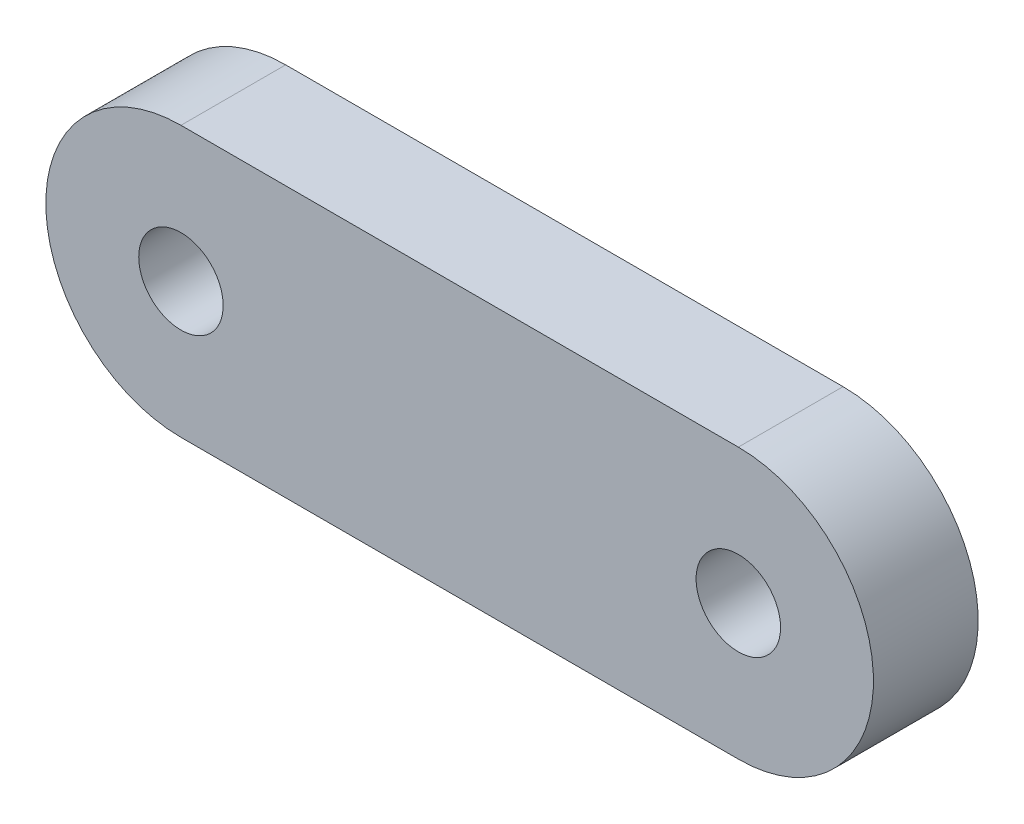
ISO-10303-21;
HEADER;
FILE_DESCRIPTION(('STEP AP214'),'2;1');
FILE_NAME('part.step','',(''),(''),'','','');
FILE_SCHEMA(('AUTOMOTIVE_DESIGN { 1 0 10303 214 1 1 1 1 }'));
ENDSEC;
DATA;
#1=APPLICATION_CONTEXT('core data for automotive mechanical design processes');
#2=APPLICATION_PROTOCOL_DEFINITION('international standard','automotive_design',2000,#1);
#3=PRODUCT_CONTEXT('',#1,'mechanical');
#4=PRODUCT('Part','Part','',(#3));
#5=PRODUCT_RELATED_PRODUCT_CATEGORY('part','',(#4));
#6=PRODUCT_DEFINITION_FORMATION('','',#4);
#7=PRODUCT_DEFINITION_CONTEXT('part definition',#1,'design');
#8=PRODUCT_DEFINITION('design','',#6,#7);
#9=PRODUCT_DEFINITION_SHAPE('','',#8);
#10=(LENGTH_UNIT() NAMED_UNIT(*) SI_UNIT(.MILLI.,.METRE.));
#11=(NAMED_UNIT(*) PLANE_ANGLE_UNIT() SI_UNIT($,.RADIAN.));
#12=(NAMED_UNIT(*) SI_UNIT($,.STERADIAN.) SOLID_ANGLE_UNIT());
#13=UNCERTAINTY_MEASURE_WITH_UNIT(LENGTH_MEASURE(1.E-05),#10,'distance_accuracy_value','');
#14=(GEOMETRIC_REPRESENTATION_CONTEXT(3) GLOBAL_UNCERTAINTY_ASSIGNED_CONTEXT((#13)) GLOBAL_UNIT_ASSIGNED_CONTEXT((#10,
#11,#12)) REPRESENTATION_CONTEXT('',''));
#15=CARTESIAN_POINT('',(0.,0.,0.));
#16=DIRECTION('',(0.,0.,1.));
#17=DIRECTION('',(1.,0.,0.));
#18=AXIS2_PLACEMENT_3D('',#15,#16,#17);
#19=CARTESIAN_POINT('',(0.,0.,6.2));
#20=DIRECTION('',(0.,0.,1.));
#21=DIRECTION('',(1.,0.,0.));
#22=AXIS2_PLACEMENT_3D('',#19,#20,#21);
#23=PLANE('',#22);
#24=CARTESIAN_POINT('',(33.,0.,6.2));
#25=DIRECTION('',(0.,0.,1.));
#26=DIRECTION('',(1.,0.,0.));
#27=AXIS2_PLACEMENT_3D('',#24,#25,#26);
#28=CIRCLE('',#27,2.5);
#29=CARTESIAN_POINT('',(35.5,0.,6.2));
#30=VERTEX_POINT('',#29);
#31=EDGE_CURVE('E140',#30,#30,#28,.T.);
#32=ORIENTED_EDGE('',*,*,#31,.F.);
#33=EDGE_LOOP('',(#32));
#34=FACE_BOUND('',#33,.T.);
#35=CARTESIAN_POINT('',(0.,0.,6.2));
#36=DIRECTION('',(0.,0.,1.));
#37=DIRECTION('',(1.,0.,0.));
#38=AXIS2_PLACEMENT_3D('',#35,#36,#37);
#39=CIRCLE('',#38,8.);
#40=CARTESIAN_POINT('',(0.,8.,6.2));
#41=VERTEX_POINT('',#40);
#42=CARTESIAN_POINT('',(0.,-8.,6.2));
#43=VERTEX_POINT('',#42);
#44=EDGE_CURVE('E94',#41,#43,#39,.T.);
#45=ORIENTED_EDGE('',*,*,#44,.T.);
#46=DIRECTION('',(1.,0.,0.));
#47=VECTOR('',#46,1.);
#48=CARTESIAN_POINT('',(0.,-8.,6.2));
#49=LINE('',#48,#47);
#50=CARTESIAN_POINT('',(33.,-8.,6.2));
#51=VERTEX_POINT('',#50);
#52=EDGE_CURVE('E89',#43,#51,#49,.T.);
#53=ORIENTED_EDGE('',*,*,#52,.T.);
#54=CARTESIAN_POINT('',(33.,0.,6.2));
#55=DIRECTION('',(0.,0.,1.));
#56=DIRECTION('',(1.,0.,0.));
#57=AXIS2_PLACEMENT_3D('',#54,#55,#56);
#58=CIRCLE('',#57,8.);
#59=CARTESIAN_POINT('',(33.,8.,6.2));
#60=VERTEX_POINT('',#59);
#61=EDGE_CURVE('E92',#51,#60,#58,.T.);
#62=ORIENTED_EDGE('',*,*,#61,.T.);
#63=DIRECTION('',(-1.,0.,0.));
#64=VECTOR('',#63,1.);
#65=CARTESIAN_POINT('',(0.,8.,6.2));
#66=LINE('',#65,#64);
#67=EDGE_CURVE('E59',#60,#41,#66,.T.);
#68=ORIENTED_EDGE('',*,*,#67,.T.);
#69=EDGE_LOOP('',(#45,#53,#62,#68));
#70=FACE_BOUND('',#69,.T.);
#71=CARTESIAN_POINT('',(0.,0.,6.2));
#72=DIRECTION('',(0.,0.,1.));
#73=DIRECTION('',(1.,0.,0.));
#74=AXIS2_PLACEMENT_3D('',#71,#72,#73);
#75=CIRCLE('',#74,2.5);
#76=CARTESIAN_POINT('',(-2.5,0.,6.2));
#77=VERTEX_POINT('',#76);
#78=EDGE_CURVE('E115',#77,#77,#75,.T.);
#79=ORIENTED_EDGE('',*,*,#78,.F.);
#80=EDGE_LOOP('',(#79));
#81=FACE_BOUND('',#80,.T.);
#82=ADVANCED_FACE('F40',(#34,#70,#81),#23,.T.);
#83=CARTESIAN_POINT('',(0.,0.,0.));
#84=DIRECTION('',(0.,0.,1.));
#85=DIRECTION('',(1.,0.,0.));
#86=AXIS2_PLACEMENT_3D('',#83,#84,#85);
#87=PLANE('',#86);
#88=CARTESIAN_POINT('',(33.,0.,0.));
#89=DIRECTION('',(0.,0.,1.));
#90=DIRECTION('',(1.,0.,0.));
#91=AXIS2_PLACEMENT_3D('',#88,#89,#90);
#92=CIRCLE('',#91,2.5);
#93=CARTESIAN_POINT('',(35.5,0.,0.));
#94=VERTEX_POINT('',#93);
#95=EDGE_CURVE('E44',#94,#94,#92,.T.);
#96=ORIENTED_EDGE('',*,*,#95,.T.);
#97=EDGE_LOOP('',(#96));
#98=FACE_BOUND('',#97,.T.);
#99=CARTESIAN_POINT('',(0.,0.,0.));
#100=DIRECTION('',(0.,0.,1.));
#101=DIRECTION('',(1.,0.,0.));
#102=AXIS2_PLACEMENT_3D('',#99,#100,#101);
#103=CIRCLE('',#102,8.);
#104=CARTESIAN_POINT('',(0.,8.,0.));
#105=VERTEX_POINT('',#104);
#106=CARTESIAN_POINT('',(0.,-8.,0.));
#107=VERTEX_POINT('',#106);
#108=EDGE_CURVE('E111',#105,#107,#103,.T.);
#109=ORIENTED_EDGE('',*,*,#108,.F.);
#110=DIRECTION('',(-1.,0.,0.));
#111=VECTOR('',#110,1.);
#112=CARTESIAN_POINT('',(0.,8.,0.));
#113=LINE('',#112,#111);
#114=CARTESIAN_POINT('',(33.,8.,0.));
#115=VERTEX_POINT('',#114);
#116=EDGE_CURVE('E82',#115,#105,#113,.T.);
#117=ORIENTED_EDGE('',*,*,#116,.F.);
#118=CARTESIAN_POINT('',(33.,0.,0.));
#119=DIRECTION('',(0.,0.,1.));
#120=DIRECTION('',(1.,0.,0.));
#121=AXIS2_PLACEMENT_3D('',#118,#119,#120);
#122=CIRCLE('',#121,8.);
#123=CARTESIAN_POINT('',(33.,-8.,0.));
#124=VERTEX_POINT('',#123);
#125=EDGE_CURVE('E76',#124,#115,#122,.T.);
#126=ORIENTED_EDGE('',*,*,#125,.F.);
#127=DIRECTION('',(1.,0.,0.));
#128=VECTOR('',#127,1.);
#129=CARTESIAN_POINT('',(0.,-8.,0.));
#130=LINE('',#129,#128);
#131=EDGE_CURVE('E99',#107,#124,#130,.T.);
#132=ORIENTED_EDGE('',*,*,#131,.F.);
#133=EDGE_LOOP('',(#109,#117,#126,#132));
#134=FACE_BOUND('',#133,.T.);
#135=CARTESIAN_POINT('',(0.,0.,0.));
#136=DIRECTION('',(0.,0.,1.));
#137=DIRECTION('',(1.,0.,0.));
#138=AXIS2_PLACEMENT_3D('',#135,#136,#137);
#139=CIRCLE('',#138,2.5);
#140=CARTESIAN_POINT('',(-2.5,0.,0.));
#141=VERTEX_POINT('',#140);
#142=EDGE_CURVE('E133',#141,#141,#139,.T.);
#143=ORIENTED_EDGE('',*,*,#142,.T.);
#144=EDGE_LOOP('',(#143));
#145=FACE_BOUND('',#144,.T.);
#146=ADVANCED_FACE('F128',(#98,#134,#145),#87,.F.);
#147=CARTESIAN_POINT('',(0.,0.,6.2));
#148=DIRECTION('',(0.,0.,-1.));
#149=DIRECTION('',(-1.,0.,0.));
#150=AXIS2_PLACEMENT_3D('',#147,#148,#149);
#151=CYLINDRICAL_SURFACE('',#150,8.);
#152=ORIENTED_EDGE('',*,*,#108,.T.);
#153=DIRECTION('',(0.,0.,-1.));
#154=VECTOR('',#153,1.);
#155=CARTESIAN_POINT('',(0.,-8.,6.2));
#156=LINE('',#155,#154);
#157=EDGE_CURVE('E11',#43,#107,#156,.T.);
#158=ORIENTED_EDGE('',*,*,#157,.F.);
#159=ORIENTED_EDGE('',*,*,#44,.F.);
#160=DIRECTION('',(0.,0.,-1.));
#161=VECTOR('',#160,1.);
#162=CARTESIAN_POINT('',(0.,8.,6.2));
#163=LINE('',#162,#161);
#164=EDGE_CURVE('E107',#41,#105,#163,.T.);
#165=ORIENTED_EDGE('',*,*,#164,.T.);
#166=EDGE_LOOP('',(#152,#158,#159,#165));
#167=FACE_BOUND('',#166,.T.);
#168=ADVANCED_FACE('F42',(#167),#151,.T.);
#169=CARTESIAN_POINT('',(0.,-8.,6.2));
#170=DIRECTION('',(0.,1.,0.));
#171=DIRECTION('',(0.,0.,1.));
#172=AXIS2_PLACEMENT_3D('',#169,#170,#171);
#173=PLANE('',#172);
#174=ORIENTED_EDGE('',*,*,#131,.T.);
#175=DIRECTION('',(0.,0.,-1.));
#176=VECTOR('',#175,1.);
#177=CARTESIAN_POINT('',(33.,-8.,6.2));
#178=LINE('',#177,#176);
#179=EDGE_CURVE('E51',#51,#124,#178,.T.);
#180=ORIENTED_EDGE('',*,*,#179,.F.);
#181=ORIENTED_EDGE('',*,*,#52,.F.);
#182=ORIENTED_EDGE('',*,*,#157,.T.);
#183=EDGE_LOOP('',(#174,#180,#181,#182));
#184=FACE_BOUND('',#183,.T.);
#185=ADVANCED_FACE('F98',(#184),#173,.F.);
#186=CARTESIAN_POINT('',(33.,0.,6.2));
#187=DIRECTION('',(0.,0.,-1.));
#188=DIRECTION('',(-1.,0.,0.));
#189=AXIS2_PLACEMENT_3D('',#186,#187,#188);
#190=CYLINDRICAL_SURFACE('',#189,8.);
#191=ORIENTED_EDGE('',*,*,#125,.T.);
#192=DIRECTION('',(0.,0.,-1.));
#193=VECTOR('',#192,1.);
#194=CARTESIAN_POINT('',(33.,8.,6.2));
#195=LINE('',#194,#193);
#196=EDGE_CURVE('E101',#60,#115,#195,.T.);
#197=ORIENTED_EDGE('',*,*,#196,.F.);
#198=ORIENTED_EDGE('',*,*,#61,.F.);
#199=ORIENTED_EDGE('',*,*,#179,.T.);
#200=EDGE_LOOP('',(#191,#197,#198,#199));
#201=FACE_BOUND('',#200,.T.);
#202=ADVANCED_FACE('F103',(#201),#190,.T.);
#203=CARTESIAN_POINT('',(0.,8.,6.2));
#204=DIRECTION('',(0.,-1.,0.));
#205=DIRECTION('',(0.,0.,-1.));
#206=AXIS2_PLACEMENT_3D('',#203,#204,#205);
#207=PLANE('',#206);
#208=ORIENTED_EDGE('',*,*,#116,.T.);
#209=ORIENTED_EDGE('',*,*,#164,.F.);
#210=ORIENTED_EDGE('',*,*,#67,.F.);
#211=ORIENTED_EDGE('',*,*,#196,.T.);
#212=EDGE_LOOP('',(#208,#209,#210,#211));
#213=FACE_BOUND('',#212,.T.);
#214=ADVANCED_FACE('F125',(#213),#207,.F.);
#215=CARTESIAN_POINT('',(0.,0.,6.2));
#216=DIRECTION('',(0.,0.,-1.));
#217=DIRECTION('',(-1.,0.,0.));
#218=AXIS2_PLACEMENT_3D('',#215,#216,#217);
#219=CYLINDRICAL_SURFACE('',#218,2.5);
#220=CARTESIAN_POINT('',(-2.5,0.,6.2));
#221=CARTESIAN_POINT('',(-2.5,0.,6.13541666666667));
#222=CARTESIAN_POINT('',(-2.5,0.,6.07083333333333));
#223=CARTESIAN_POINT('',(-2.5,0.,5.94166666666667));
#224=CARTESIAN_POINT('',(-2.5,0.,5.87708333333333));
#225=CARTESIAN_POINT('',(-2.5,0.,5.74791666666667));
#226=CARTESIAN_POINT('',(-2.5,0.,5.68333333333333));
#227=CARTESIAN_POINT('',(-2.5,0.,5.55416666666667));
#228=CARTESIAN_POINT('',(-2.5,0.,5.48958333333333));
#229=CARTESIAN_POINT('',(-2.5,0.,5.36041666666667));
#230=CARTESIAN_POINT('',(-2.5,0.,5.29583333333333));
#231=CARTESIAN_POINT('',(-2.5,0.,5.16666666666667));
#232=CARTESIAN_POINT('',(-2.5,0.,5.10208333333333));
#233=CARTESIAN_POINT('',(-2.5,0.,4.97291666666667));
#234=CARTESIAN_POINT('',(-2.5,0.,4.90833333333333));
#235=CARTESIAN_POINT('',(-2.5,0.,4.77916666666667));
#236=CARTESIAN_POINT('',(-2.5,0.,4.71458333333333));
#237=CARTESIAN_POINT('',(-2.5,0.,4.58541666666667));
#238=CARTESIAN_POINT('',(-2.5,0.,4.52083333333333));
#239=CARTESIAN_POINT('',(-2.5,0.,4.39166666666667));
#240=CARTESIAN_POINT('',(-2.5,0.,4.32708333333333));
#241=CARTESIAN_POINT('',(-2.5,0.,4.19791666666667));
#242=CARTESIAN_POINT('',(-2.5,0.,4.13333333333333));
#243=CARTESIAN_POINT('',(-2.5,0.,4.00416666666667));
#244=CARTESIAN_POINT('',(-2.5,0.,3.93958333333333));
#245=CARTESIAN_POINT('',(-2.5,0.,3.81041666666667));
#246=CARTESIAN_POINT('',(-2.5,0.,3.74583333333333));
#247=CARTESIAN_POINT('',(-2.5,0.,3.61666666666667));
#248=CARTESIAN_POINT('',(-2.5,0.,3.55208333333333));
#249=CARTESIAN_POINT('',(-2.5,0.,3.42291666666667));
#250=CARTESIAN_POINT('',(-2.5,0.,3.35833333333333));
#251=CARTESIAN_POINT('',(-2.5,0.,3.22916666666667));
#252=CARTESIAN_POINT('',(-2.5,0.,3.16458333333333));
#253=CARTESIAN_POINT('',(-2.5,0.,3.03541666666667));
#254=CARTESIAN_POINT('',(-2.5,0.,2.97083333333333));
#255=CARTESIAN_POINT('',(-2.5,0.,2.84166666666667));
#256=CARTESIAN_POINT('',(-2.5,0.,2.77708333333333));
#257=CARTESIAN_POINT('',(-2.5,0.,2.64791666666667));
#258=CARTESIAN_POINT('',(-2.5,0.,2.58333333333333));
#259=CARTESIAN_POINT('',(-2.5,0.,2.45416666666667));
#260=CARTESIAN_POINT('',(-2.5,0.,2.38958333333333));
#261=CARTESIAN_POINT('',(-2.5,0.,2.26041666666667));
#262=CARTESIAN_POINT('',(-2.5,0.,2.19583333333333));
#263=CARTESIAN_POINT('',(-2.5,0.,2.06666666666667));
#264=CARTESIAN_POINT('',(-2.5,0.,2.00208333333333));
#265=CARTESIAN_POINT('',(-2.5,0.,1.87291666666667));
#266=CARTESIAN_POINT('',(-2.5,0.,1.80833333333333));
#267=CARTESIAN_POINT('',(-2.5,0.,1.67916666666667));
#268=CARTESIAN_POINT('',(-2.5,0.,1.61458333333333));
#269=CARTESIAN_POINT('',(-2.5,0.,1.48541666666667));
#270=CARTESIAN_POINT('',(-2.5,0.,1.42083333333333));
#271=CARTESIAN_POINT('',(-2.5,0.,1.29166666666667));
#272=CARTESIAN_POINT('',(-2.5,0.,1.22708333333333));
#273=CARTESIAN_POINT('',(-2.5,0.,1.09791666666667));
#274=CARTESIAN_POINT('',(-2.5,0.,1.03333333333333));
#275=CARTESIAN_POINT('',(-2.5,0.,0.904166666666667));
#276=CARTESIAN_POINT('',(-2.5,0.,0.839583333333333));
#277=CARTESIAN_POINT('',(-2.5,0.,0.710416666666666));
#278=CARTESIAN_POINT('',(-2.5,0.,0.645833333333333));
#279=CARTESIAN_POINT('',(-2.5,0.,0.516666666666667));
#280=CARTESIAN_POINT('',(-2.5,0.,0.452083333333333));
#281=CARTESIAN_POINT('',(-2.5,0.,0.322916666666667));
#282=CARTESIAN_POINT('',(-2.5,0.,0.258333333333334));
#283=CARTESIAN_POINT('',(-2.5,0.,0.129166666666667));
#284=CARTESIAN_POINT('',(-2.5,0.,0.0645833333333335));
#285=CARTESIAN_POINT('',(-2.5,0.,0.));
#286=B_SPLINE_CURVE_WITH_KNOTS('',3,(#220,#221,#222,#223,#224,#225,#226,#227,#228,#229,#230,
#231,#232,#233,#234,#235,#236,#237,#238,#239,#240,#241,#242,#243,#244,#245,#246,#247,#248,#249,
#250,#251,#252,#253,#254,#255,#256,#257,#258,#259,#260,#261,#262,#263,#264,#265,#266,#267,#268,
#269,#270,#271,#272,#273,#274,#275,#276,#277,#278,#279,#280,#281,#282,#283,#284,#285),
.UNSPECIFIED.,.F.,.F.,(4,2,2,2,2,2,2,2,2,2,2,2,2,2,2,2,2,2,2,2,2,2,2,2,2,2,2,2,2,2,2,2,4),(0.,
0.193749999999999,0.3875,0.581249999999999,0.775,0.968749999999999,1.1625,1.35625,1.55,1.74375,
1.9375,2.13125,2.325,2.51875,2.7125,2.90625,3.1,3.29375,3.4875,3.68125,3.875,4.06875,4.2625,
4.45625,4.65,4.84375,5.0375,5.23125,5.425,5.61875,5.8125,6.00625,6.2),.UNSPECIFIED.);
#287=EDGE_CURVE('BSEAM152',#77,#141,#286,.T.);
#288=ORIENTED_EDGE('',*,*,#78,.T.);
#289=ORIENTED_EDGE('',*,*,#142,.F.);
#290=ORIENTED_EDGE('',*,*,#287,.T.);
#291=ORIENTED_EDGE('',*,*,#287,.F.);
#292=EDGE_LOOP('',(#288,#290,#289,#291));
#293=FACE_BOUND('',#292,.T.);
#294=ADVANCED_FACE('F152',(#293),#219,.F.);
#295=CARTESIAN_POINT('',(33.,0.,-10.));
#296=DIRECTION('',(0.,0.,1.));
#297=DIRECTION('',(1.,0.,0.));
#298=AXIS2_PLACEMENT_3D('',#295,#296,#297);
#299=CYLINDRICAL_SURFACE('',#298,2.5);
#300=ORIENTED_EDGE('',*,*,#31,.T.);
#301=EDGE_LOOP('',(#300));
#302=FACE_BOUND('',#301,.T.);
#303=ORIENTED_EDGE('',*,*,#95,.F.);
#304=EDGE_LOOP('',(#303));
#305=FACE_BOUND('',#304,.T.);
#306=ADVANCED_FACE('F150',(#302,#305),#299,.F.);
#307=CLOSED_SHELL('',(#82,#146,#168,#185,#202,#214,#294,#306));
#308=MANIFOLD_SOLID_BREP('B2',#307);
#309=ADVANCED_BREP_SHAPE_REPRESENTATION('',(#18,#308),#14);
#310=SHAPE_DEFINITION_REPRESENTATION(#9,#309);
ENDSEC;
END-ISO-10303-21;
